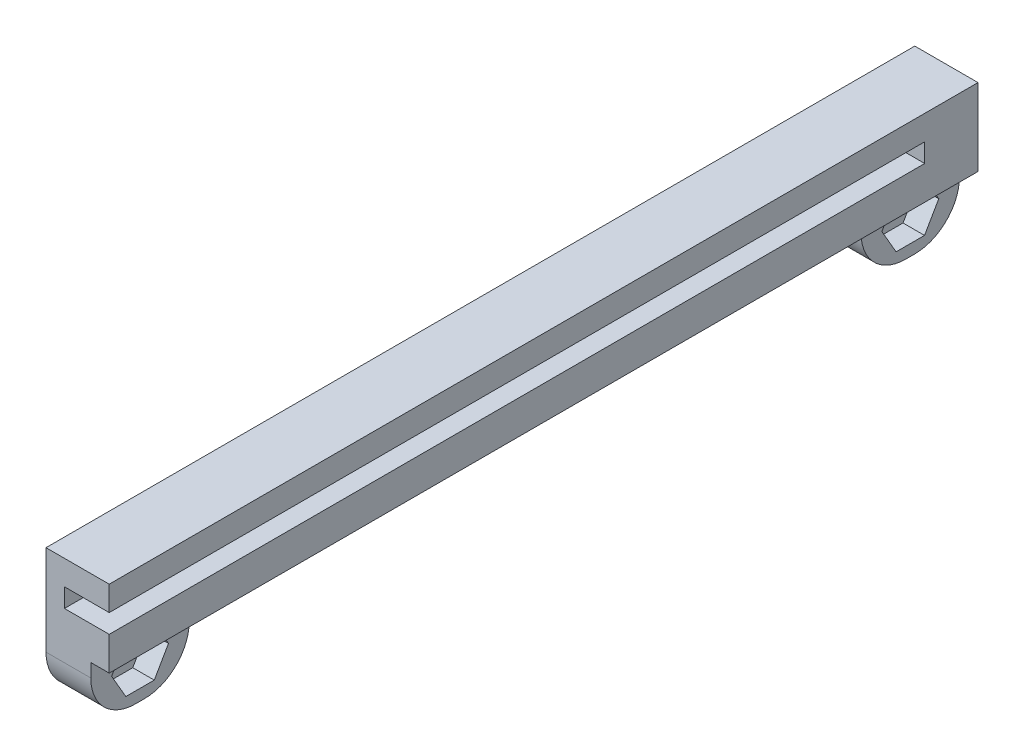
ISO-10303-21;
HEADER;
FILE_DESCRIPTION(('STEP AP214'),'2;1');
FILE_NAME('part.step','',(''),(''),'','','');
FILE_SCHEMA(('AUTOMOTIVE_DESIGN { 1 0 10303 214 1 1 1 1 }'));
ENDSEC;
DATA;
#1=APPLICATION_CONTEXT('core data for automotive mechanical design processes');
#2=APPLICATION_PROTOCOL_DEFINITION('international standard','automotive_design',2000,#1);
#3=PRODUCT_CONTEXT('',#1,'mechanical');
#4=PRODUCT('Part','Part','',(#3));
#5=PRODUCT_RELATED_PRODUCT_CATEGORY('part','',(#4));
#6=PRODUCT_DEFINITION_FORMATION('','',#4);
#7=PRODUCT_DEFINITION_CONTEXT('part definition',#1,'design');
#8=PRODUCT_DEFINITION('design','',#6,#7);
#9=PRODUCT_DEFINITION_SHAPE('','',#8);
#10=(LENGTH_UNIT() NAMED_UNIT(*) SI_UNIT(.MILLI.,.METRE.));
#11=(NAMED_UNIT(*) PLANE_ANGLE_UNIT() SI_UNIT($,.RADIAN.));
#12=(NAMED_UNIT(*) SI_UNIT($,.STERADIAN.) SOLID_ANGLE_UNIT());
#13=UNCERTAINTY_MEASURE_WITH_UNIT(LENGTH_MEASURE(1.E-05),#10,'distance_accuracy_value','');
#14=(GEOMETRIC_REPRESENTATION_CONTEXT(3) GLOBAL_UNCERTAINTY_ASSIGNED_CONTEXT((#13)) GLOBAL_UNIT_ASSIGNED_CONTEXT((#10,
#11,#12)) REPRESENTATION_CONTEXT('',''));
#15=CARTESIAN_POINT('',(0.,0.,0.));
#16=DIRECTION('',(0.,0.,1.));
#17=DIRECTION('',(1.,0.,0.));
#18=AXIS2_PLACEMENT_3D('',#15,#16,#17);
#19=CARTESIAN_POINT('',(3.52875,7.6,48.5));
#20=DIRECTION('',(-1.,0.,0.));
#21=DIRECTION('',(0.,0.,1.));
#22=AXIS2_PLACEMENT_3D('',#19,#20,#21);
#23=PLANE('',#22);
#24=DIRECTION('',(0.,0.,-1.));
#25=VECTOR('',#24,1.);
#26=CARTESIAN_POINT('',(3.52875,7.6,48.5));
#27=LINE('',#26,#25);
#28=CARTESIAN_POINT('',(3.52875000000002,7.6,48.5));
#29=VERTEX_POINT('',#28);
#30=CARTESIAN_POINT('',(3.52875,7.6,-48.5));
#31=VERTEX_POINT('',#30);
#32=EDGE_CURVE('E506',#29,#31,#27,.T.);
#33=ORIENTED_EDGE('',*,*,#32,.F.);
#34=DIRECTION('',(0.,1.,0.));
#35=VECTOR('',#34,1.);
#36=CARTESIAN_POINT('',(3.52875000000002,4.85,48.5));
#37=LINE('',#36,#35);
#38=CARTESIAN_POINT('',(3.52875000000002,4.85,48.5));
#39=VERTEX_POINT('',#38);
#40=EDGE_CURVE('E482',#39,#29,#37,.T.);
#41=ORIENTED_EDGE('',*,*,#40,.F.);
#42=DIRECTION('',(0.,0.,-1.));
#43=VECTOR('',#42,1.);
#44=CARTESIAN_POINT('',(3.52875,4.85,-42.55));
#45=LINE('',#44,#43);
#46=CARTESIAN_POINT('',(3.52875,4.85,-42.55));
#47=VERTEX_POINT('',#46);
#48=EDGE_CURVE('E468',#39,#47,#45,.T.);
#49=ORIENTED_EDGE('',*,*,#48,.T.);
#50=DIRECTION('',(0.,1.,0.));
#51=VECTOR('',#50,1.);
#52=CARTESIAN_POINT('',(3.52875,2.75,-42.55));
#53=LINE('',#52,#51);
#54=CARTESIAN_POINT('',(3.52875,2.75,-42.55));
#55=VERTEX_POINT('',#54);
#56=EDGE_CURVE('E501',#55,#47,#53,.T.);
#57=ORIENTED_EDGE('',*,*,#56,.F.);
#58=DIRECTION('',(0.,0.,-1.));
#59=VECTOR('',#58,1.);
#60=CARTESIAN_POINT('',(3.52875,2.75,-42.55));
#61=LINE('',#60,#59);
#62=CARTESIAN_POINT('',(3.52875000000002,2.75,48.5));
#63=VERTEX_POINT('',#62);
#64=EDGE_CURVE('E486',#63,#55,#61,.T.);
#65=ORIENTED_EDGE('',*,*,#64,.F.);
#66=DIRECTION('',(0.,-1.,0.));
#67=VECTOR('',#66,1.);
#68=CARTESIAN_POINT('',(3.52875,7.6,48.5));
#69=LINE('',#68,#67);
#70=CARTESIAN_POINT('',(3.52874999999999,-1.,48.5));
#71=VERTEX_POINT('',#70);
#72=EDGE_CURVE('E524',#63,#71,#69,.T.);
#73=ORIENTED_EDGE('',*,*,#72,.T.);
#74=DIRECTION('',(0.,0.,1.));
#75=VECTOR('',#74,1.);
#76=CARTESIAN_POINT('',(3.52874999999999,-1.,48.5));
#77=LINE('',#76,#75);
#78=CARTESIAN_POINT('',(3.52875,-1.,-48.5));
#79=VERTEX_POINT('',#78);
#80=EDGE_CURVE('E460',#79,#71,#77,.T.);
#81=ORIENTED_EDGE('',*,*,#80,.F.);
#82=DIRECTION('',(0.,-1.,0.));
#83=VECTOR('',#82,1.);
#84=CARTESIAN_POINT('',(3.52875,7.6,-48.5));
#85=LINE('',#84,#83);
#86=EDGE_CURVE('E535',#31,#79,#85,.T.);
#87=ORIENTED_EDGE('',*,*,#86,.F.);
#88=EDGE_LOOP('',(#33,#41,#49,#57,#65,#73,#81,#87));
#89=FACE_BOUND('',#88,.T.);
#90=ADVANCED_FACE('F39',(#89),#23,.F.);
#91=CARTESIAN_POINT('',(-3.52875000000001,7.6,-48.5));
#92=DIRECTION('',(0.,0.,1.));
#93=DIRECTION('',(1.,0.,0.));
#94=AXIS2_PLACEMENT_3D('',#91,#92,#93);
#95=PLANE('',#94);
#96=DIRECTION('',(0.,1.,0.));
#97=VECTOR('',#96,1.);
#98=CARTESIAN_POINT('',(1.47125,-7.5,-48.5));
#99=LINE('',#98,#97);
#100=CARTESIAN_POINT('',(1.47125,-2.5,-48.5));
#101=VERTEX_POINT('',#100);
#102=CARTESIAN_POINT('',(1.47125,-1.,-48.5));
#103=VERTEX_POINT('',#102);
#104=EDGE_CURVE('E405',#101,#103,#99,.T.);
#105=ORIENTED_EDGE('',*,*,#104,.F.);
#106=DIRECTION('',(1.,0.,0.));
#107=VECTOR('',#106,1.);
#108=CARTESIAN_POINT('',(-3.52875,-2.5,-48.5));
#109=LINE('',#108,#107);
#110=CARTESIAN_POINT('',(-3.52875000000001,-2.5,-48.5));
#111=VERTEX_POINT('',#110);
#112=EDGE_CURVE('E559',#101,#111,#109,.F.);
#113=ORIENTED_EDGE('',*,*,#112,.T.);
#114=DIRECTION('',(0.,-1.,0.));
#115=VECTOR('',#114,1.);
#116=CARTESIAN_POINT('',(-3.52875000000001,7.6,-48.5));
#117=LINE('',#116,#115);
#118=CARTESIAN_POINT('',(-3.52875000000001,7.6,-48.5));
#119=VERTEX_POINT('',#118);
#120=EDGE_CURVE('E531',#119,#111,#117,.T.);
#121=ORIENTED_EDGE('',*,*,#120,.F.);
#122=DIRECTION('',(-1.,0.,0.));
#123=VECTOR('',#122,1.);
#124=CARTESIAN_POINT('',(-3.52875000000001,7.6,-48.5));
#125=LINE('',#124,#123);
#126=EDGE_CURVE('E515',#31,#119,#125,.T.);
#127=ORIENTED_EDGE('',*,*,#126,.F.);
#128=ORIENTED_EDGE('',*,*,#86,.T.);
#129=DIRECTION('',(1.,0.,0.));
#130=VECTOR('',#129,1.);
#131=CARTESIAN_POINT('',(-3.52875,-1.,-48.5));
#132=LINE('',#131,#130);
#133=EDGE_CURVE('E457',#103,#79,#132,.T.);
#134=ORIENTED_EDGE('',*,*,#133,.F.);
#135=EDGE_LOOP('',(#105,#113,#121,#127,#128,#134));
#136=FACE_BOUND('',#135,.T.);
#137=ADVANCED_FACE('F628',(#136),#95,.F.);
#138=CARTESIAN_POINT('',(-3.52875000000001,7.6,48.5));
#139=DIRECTION('',(1.,0.,0.));
#140=DIRECTION('',(0.,0.,-1.));
#141=AXIS2_PLACEMENT_3D('',#138,#139,#140);
#142=PLANE('',#141);
#143=CARTESIAN_POINT('',(-3.52875000000003,-3.5,43.));
#144=DIRECTION('',(1.,0.,0.));
#145=DIRECTION('',(0.,0.,-1.));
#146=AXIS2_PLACEMENT_3D('',#143,#144,#145);
#147=CIRCLE('',#146,1.85);
#148=CARTESIAN_POINT('',(-3.52875000000003,-3.5,41.15));
#149=VERTEX_POINT('',#148);
#150=EDGE_CURVE('E362',#149,#149,#147,.T.);
#151=ORIENTED_EDGE('',*,*,#150,.T.);
#152=EDGE_LOOP('',(#151));
#153=FACE_BOUND('',#152,.T.);
#154=CARTESIAN_POINT('',(-3.52875000000001,-3.5,-43.));
#155=DIRECTION('',(1.,0.,0.));
#156=DIRECTION('',(0.,0.,-1.));
#157=AXIS2_PLACEMENT_3D('',#154,#155,#156);
#158=CIRCLE('',#157,1.85);
#159=CARTESIAN_POINT('',(-3.52875000000001,-3.5,-44.85));
#160=VERTEX_POINT('',#159);
#161=EDGE_CURVE('E285',#160,#160,#158,.T.);
#162=ORIENTED_EDGE('',*,*,#161,.T.);
#163=EDGE_LOOP('',(#162));
#164=FACE_BOUND('',#163,.T.);
#165=ORIENTED_EDGE('',*,*,#120,.T.);
#166=CARTESIAN_POINT('',(-3.52875000000001,-2.5,-43.5));
#167=DIRECTION('',(1.,0.,0.));
#168=DIRECTION('',(0.,0.,-1.));
#169=AXIS2_PLACEMENT_3D('',#166,#167,#168);
#170=CIRCLE('',#169,5.);
#171=CARTESIAN_POINT('',(-3.52875,-7.5,-43.5));
#172=VERTEX_POINT('',#171);
#173=EDGE_CURVE('E571',#111,#172,#170,.F.);
#174=ORIENTED_EDGE('',*,*,#173,.T.);
#175=DIRECTION('',(0.,0.,1.));
#176=VECTOR('',#175,1.);
#177=CARTESIAN_POINT('',(-3.52875,-7.5,-48.5));
#178=LINE('',#177,#176);
#179=CARTESIAN_POINT('',(-3.52875,-7.5,-42.5));
#180=VERTEX_POINT('',#179);
#181=EDGE_CURVE('E404',#172,#180,#178,.T.);
#182=ORIENTED_EDGE('',*,*,#181,.T.);
#183=CARTESIAN_POINT('',(-3.52875000000001,-2.5,-42.5));
#184=DIRECTION('',(1.,0.,0.));
#185=DIRECTION('',(0.,0.,-1.));
#186=AXIS2_PLACEMENT_3D('',#183,#184,#185);
#187=CIRCLE('',#186,5.);
#188=CARTESIAN_POINT('',(-3.52875,-2.5,-37.5));
#189=VERTEX_POINT('',#188);
#190=EDGE_CURVE('E568',#180,#189,#187,.F.);
#191=ORIENTED_EDGE('',*,*,#190,.T.);
#192=DIRECTION('',(0.,1.,0.));
#193=VECTOR('',#192,1.);
#194=CARTESIAN_POINT('',(-3.52875,-7.5,-37.5));
#195=LINE('',#194,#193);
#196=CARTESIAN_POINT('',(-3.52875,-1.,-37.5));
#197=VERTEX_POINT('',#196);
#198=EDGE_CURVE('E320',#189,#197,#195,.T.);
#199=ORIENTED_EDGE('',*,*,#198,.T.);
#200=DIRECTION('',(0.,0.,-1.));
#201=VECTOR('',#200,1.);
#202=CARTESIAN_POINT('',(-3.52875000000001,-1.,48.5));
#203=LINE('',#202,#201);
#204=CARTESIAN_POINT('',(-3.52875000000001,-1.,37.5));
#205=VERTEX_POINT('',#204);
#206=EDGE_CURVE('E453',#205,#197,#203,.T.);
#207=ORIENTED_EDGE('',*,*,#206,.F.);
#208=DIRECTION('',(0.,1.,0.));
#209=VECTOR('',#208,1.);
#210=CARTESIAN_POINT('',(-3.52875000000001,-7.5,37.5));
#211=LINE('',#210,#209);
#212=CARTESIAN_POINT('',(-3.52875000000001,-2.5,37.5));
#213=VERTEX_POINT('',#212);
#214=EDGE_CURVE('E436',#213,#205,#211,.T.);
#215=ORIENTED_EDGE('',*,*,#214,.F.);
#216=CARTESIAN_POINT('',(-3.52875000000001,-2.5,42.5));
#217=DIRECTION('',(1.,0.,0.));
#218=DIRECTION('',(0.,0.,-1.));
#219=AXIS2_PLACEMENT_3D('',#216,#217,#218);
#220=CIRCLE('',#219,5.);
#221=CARTESIAN_POINT('',(-3.52875000000001,-7.5,42.5));
#222=VERTEX_POINT('',#221);
#223=EDGE_CURVE('E565',#213,#222,#220,.F.);
#224=ORIENTED_EDGE('',*,*,#223,.T.);
#225=DIRECTION('',(0.,0.,-1.));
#226=VECTOR('',#225,1.);
#227=CARTESIAN_POINT('',(-3.52875000000001,-7.5,48.5));
#228=LINE('',#227,#226);
#229=CARTESIAN_POINT('',(-3.52875000000001,-7.5,43.5));
#230=VERTEX_POINT('',#229);
#231=EDGE_CURVE('E431',#230,#222,#228,.T.);
#232=ORIENTED_EDGE('',*,*,#231,.F.);
#233=CARTESIAN_POINT('',(-3.52875000000001,-2.5,43.5));
#234=DIRECTION('',(1.,0.,0.));
#235=DIRECTION('',(0.,0.,-1.));
#236=AXIS2_PLACEMENT_3D('',#233,#234,#235);
#237=CIRCLE('',#236,5.);
#238=CARTESIAN_POINT('',(-3.52875000000001,-2.5,48.5));
#239=VERTEX_POINT('',#238);
#240=EDGE_CURVE('E562',#230,#239,#237,.F.);
#241=ORIENTED_EDGE('',*,*,#240,.T.);
#242=DIRECTION('',(0.,-1.,0.));
#243=VECTOR('',#242,1.);
#244=CARTESIAN_POINT('',(-3.52875000000001,7.6,48.5));
#245=LINE('',#244,#243);
#246=CARTESIAN_POINT('',(-3.52875000000001,7.6,48.5));
#247=VERTEX_POINT('',#246);
#248=EDGE_CURVE('E527',#247,#239,#245,.T.);
#249=ORIENTED_EDGE('',*,*,#248,.F.);
#250=DIRECTION('',(0.,0.,1.));
#251=VECTOR('',#250,1.);
#252=CARTESIAN_POINT('',(-3.52875000000001,7.6,48.5));
#253=LINE('',#252,#251);
#254=EDGE_CURVE('E518',#119,#247,#253,.T.);
#255=ORIENTED_EDGE('',*,*,#254,.F.);
#256=EDGE_LOOP('',(#165,#174,#182,#191,#199,#207,#215,#224,#232,#241,#249,#255));
#257=FACE_BOUND('',#256,.T.);
#258=ADVANCED_FACE('F598',(#153,#164,#257),#142,.F.);
#259=CARTESIAN_POINT('',(-3.52875000000001,7.6,48.5));
#260=DIRECTION('',(0.,0.,-1.));
#261=DIRECTION('',(-1.,0.,0.));
#262=AXIS2_PLACEMENT_3D('',#259,#260,#261);
#263=PLANE('',#262);
#264=ORIENTED_EDGE('',*,*,#248,.T.);
#265=DIRECTION('',(1.,0.,0.));
#266=VECTOR('',#265,1.);
#267=CARTESIAN_POINT('',(-3.52875000000001,-2.5,48.5));
#268=LINE('',#267,#266);
#269=CARTESIAN_POINT('',(1.47124999999999,-2.5,48.5));
#270=VERTEX_POINT('',#269);
#271=EDGE_CURVE('E11',#239,#270,#268,.T.);
#272=ORIENTED_EDGE('',*,*,#271,.T.);
#273=DIRECTION('',(0.,1.,0.));
#274=VECTOR('',#273,1.);
#275=CARTESIAN_POINT('',(1.47124999999999,-7.5,48.5));
#276=LINE('',#275,#274);
#277=CARTESIAN_POINT('',(1.47124999999999,-1.,48.5));
#278=VERTEX_POINT('',#277);
#279=EDGE_CURVE('E447',#270,#278,#276,.T.);
#280=ORIENTED_EDGE('',*,*,#279,.T.);
#281=DIRECTION('',(-1.,0.,0.));
#282=VECTOR('',#281,1.);
#283=CARTESIAN_POINT('',(-3.52875000000001,-1.,48.5));
#284=LINE('',#283,#282);
#285=EDGE_CURVE('E464',#71,#278,#284,.T.);
#286=ORIENTED_EDGE('',*,*,#285,.F.);
#287=ORIENTED_EDGE('',*,*,#72,.F.);
#288=DIRECTION('',(1.,0.,0.));
#289=VECTOR('',#288,1.);
#290=CARTESIAN_POINT('',(3.52875000000002,2.75,48.5));
#291=LINE('',#290,#289);
#292=CARTESIAN_POINT('',(-1.47125000000001,2.75,48.5));
#293=VERTEX_POINT('',#292);
#294=EDGE_CURVE('E498',#293,#63,#291,.T.);
#295=ORIENTED_EDGE('',*,*,#294,.F.);
#296=DIRECTION('',(0.,1.,0.));
#297=VECTOR('',#296,1.);
#298=CARTESIAN_POINT('',(-1.47125000000001,2.75,48.5));
#299=LINE('',#298,#297);
#300=CARTESIAN_POINT('',(-1.47125000000001,4.85,48.5));
#301=VERTEX_POINT('',#300);
#302=EDGE_CURVE('E502',#293,#301,#299,.T.);
#303=ORIENTED_EDGE('',*,*,#302,.T.);
#304=DIRECTION('',(1.,0.,0.));
#305=VECTOR('',#304,1.);
#306=CARTESIAN_POINT('',(3.52875000000002,4.85,48.5));
#307=LINE('',#306,#305);
#308=EDGE_CURVE('E478',#301,#39,#307,.T.);
#309=ORIENTED_EDGE('',*,*,#308,.T.);
#310=ORIENTED_EDGE('',*,*,#40,.T.);
#311=DIRECTION('',(1.,0.,0.));
#312=VECTOR('',#311,1.);
#313=CARTESIAN_POINT('',(-3.52875000000001,7.6,48.5));
#314=LINE('',#313,#312);
#315=EDGE_CURVE('E521',#247,#29,#314,.T.);
#316=ORIENTED_EDGE('',*,*,#315,.F.);
#317=EDGE_LOOP('',(#264,#272,#280,#286,#287,#295,#303,#309,#310,#316));
#318=FACE_BOUND('',#317,.T.);
#319=ADVANCED_FACE('F611',(#318),#263,.F.);
#320=CARTESIAN_POINT('',(0.,7.6,0.));
#321=DIRECTION('',(0.,-1.,0.));
#322=DIRECTION('',(0.,0.,-1.));
#323=AXIS2_PLACEMENT_3D('',#320,#321,#322);
#324=PLANE('',#323);
#325=ORIENTED_EDGE('',*,*,#315,.T.);
#326=ORIENTED_EDGE('',*,*,#32,.T.);
#327=ORIENTED_EDGE('',*,*,#126,.T.);
#328=ORIENTED_EDGE('',*,*,#254,.T.);
#329=EDGE_LOOP('',(#325,#326,#327,#328));
#330=FACE_BOUND('',#329,.T.);
#331=ADVANCED_FACE('F619',(#330),#324,.F.);
#332=CARTESIAN_POINT('',(-1.47125000000001,2.75,-42.55));
#333=DIRECTION('',(-1.,0.,0.));
#334=DIRECTION('',(0.,0.,1.));
#335=AXIS2_PLACEMENT_3D('',#332,#333,#334);
#336=PLANE('',#335);
#337=DIRECTION('',(0.,1.,0.));
#338=VECTOR('',#337,1.);
#339=CARTESIAN_POINT('',(-1.47125000000001,2.75,-42.55));
#340=LINE('',#339,#338);
#341=CARTESIAN_POINT('',(-1.47125000000001,2.75,-42.55));
#342=VERTEX_POINT('',#341);
#343=CARTESIAN_POINT('',(-1.47125000000001,4.85,-42.55));
#344=VERTEX_POINT('',#343);
#345=EDGE_CURVE('E507',#342,#344,#340,.T.);
#346=ORIENTED_EDGE('',*,*,#345,.T.);
#347=DIRECTION('',(0.,0.,1.));
#348=VECTOR('',#347,1.);
#349=CARTESIAN_POINT('',(-1.47125000000002,4.85,-42.55));
#350=LINE('',#349,#348);
#351=EDGE_CURVE('E475',#344,#301,#350,.T.);
#352=ORIENTED_EDGE('',*,*,#351,.T.);
#353=ORIENTED_EDGE('',*,*,#302,.F.);
#354=DIRECTION('',(0.,0.,1.));
#355=VECTOR('',#354,1.);
#356=CARTESIAN_POINT('',(-1.47125000000001,2.75,-42.55));
#357=LINE('',#356,#355);
#358=EDGE_CURVE('E494',#342,#293,#357,.T.);
#359=ORIENTED_EDGE('',*,*,#358,.F.);
#360=EDGE_LOOP('',(#346,#352,#353,#359));
#361=FACE_BOUND('',#360,.T.);
#362=ADVANCED_FACE('F998',(#361),#336,.F.);
#363=CARTESIAN_POINT('',(3.52875,2.75,-42.55));
#364=DIRECTION('',(0.,0.,-1.));
#365=DIRECTION('',(-1.,0.,0.));
#366=AXIS2_PLACEMENT_3D('',#363,#364,#365);
#367=PLANE('',#366);
#368=ORIENTED_EDGE('',*,*,#56,.T.);
#369=DIRECTION('',(-1.,0.,0.));
#370=VECTOR('',#369,1.);
#371=CARTESIAN_POINT('',(3.52875,4.85,-42.55));
#372=LINE('',#371,#370);
#373=EDGE_CURVE('E472',#47,#344,#372,.T.);
#374=ORIENTED_EDGE('',*,*,#373,.T.);
#375=ORIENTED_EDGE('',*,*,#345,.F.);
#376=DIRECTION('',(-1.,0.,0.));
#377=VECTOR('',#376,1.);
#378=CARTESIAN_POINT('',(3.52875,2.75,-42.55));
#379=LINE('',#378,#377);
#380=EDGE_CURVE('E490',#55,#342,#379,.T.);
#381=ORIENTED_EDGE('',*,*,#380,.F.);
#382=EDGE_LOOP('',(#368,#374,#375,#381));
#383=FACE_BOUND('',#382,.T.);
#384=ADVANCED_FACE('F993',(#383),#367,.F.);
#385=CARTESIAN_POINT('',(0.,2.75,0.));
#386=DIRECTION('',(0.,-1.,0.));
#387=DIRECTION('',(0.,0.,-1.));
#388=AXIS2_PLACEMENT_3D('',#385,#386,#387);
#389=PLANE('',#388);
#390=ORIENTED_EDGE('',*,*,#64,.T.);
#391=ORIENTED_EDGE('',*,*,#380,.T.);
#392=ORIENTED_EDGE('',*,*,#358,.T.);
#393=ORIENTED_EDGE('',*,*,#294,.T.);
#394=EDGE_LOOP('',(#390,#391,#392,#393));
#395=FACE_BOUND('',#394,.T.);
#396=ADVANCED_FACE('F985',(#395),#389,.F.);
#397=CARTESIAN_POINT('',(0.,4.85,0.));
#398=DIRECTION('',(0.,-1.,0.));
#399=DIRECTION('',(0.,0.,-1.));
#400=AXIS2_PLACEMENT_3D('',#397,#398,#399);
#401=PLANE('',#400);
#402=ORIENTED_EDGE('',*,*,#48,.F.);
#403=ORIENTED_EDGE('',*,*,#308,.F.);
#404=ORIENTED_EDGE('',*,*,#351,.F.);
#405=ORIENTED_EDGE('',*,*,#373,.F.);
#406=EDGE_LOOP('',(#402,#403,#404,#405));
#407=FACE_BOUND('',#406,.T.);
#408=ADVANCED_FACE('F970',(#407),#401,.T.);
#409=CARTESIAN_POINT('',(0.,-1.,0.));
#410=DIRECTION('',(0.,-1.,0.));
#411=DIRECTION('',(0.,0.,-1.));
#412=AXIS2_PLACEMENT_3D('',#409,#410,#411);
#413=PLANE('',#412);
#414=DIRECTION('',(1.,0.,0.));
#415=VECTOR('',#414,1.);
#416=CARTESIAN_POINT('',(-3.52875,-1.,-37.5));
#417=LINE('',#416,#415);
#418=CARTESIAN_POINT('',(1.47125,-1.,-37.5));
#419=VERTEX_POINT('',#418);
#420=EDGE_CURVE('E414',#197,#419,#417,.T.);
#421=ORIENTED_EDGE('',*,*,#420,.T.);
#422=DIRECTION('',(0.,0.,1.));
#423=VECTOR('',#422,1.);
#424=CARTESIAN_POINT('',(1.47125,-1.,-48.5));
#425=LINE('',#424,#423);
#426=CARTESIAN_POINT('',(1.47125000000001,-1.,-41.2679491924311));
#427=VERTEX_POINT('',#426);
#428=EDGE_CURVE('E416',#427,#419,#425,.T.);
#429=ORIENTED_EDGE('',*,*,#428,.F.);
#430=CARTESIAN_POINT('',(1.47125000000001,-1.,-44.7320508075689));
#431=VERTEX_POINT('',#430);
#432=EDGE_CURVE('E415',#431,#427,#425,.T.);
#433=ORIENTED_EDGE('',*,*,#432,.F.);
#434=EDGE_CURVE('E410',#103,#431,#425,.T.);
#435=ORIENTED_EDGE('',*,*,#434,.F.);
#436=ORIENTED_EDGE('',*,*,#133,.T.);
#437=ORIENTED_EDGE('',*,*,#80,.T.);
#438=ORIENTED_EDGE('',*,*,#285,.T.);
#439=DIRECTION('',(0.,0.,-1.));
#440=VECTOR('',#439,1.);
#441=CARTESIAN_POINT('',(1.47124999999999,-1.,48.5));
#442=LINE('',#441,#440);
#443=CARTESIAN_POINT('',(1.47124999999999,-1.,44.7320508075689));
#444=VERTEX_POINT('',#443);
#445=EDGE_CURVE('E432',#278,#444,#442,.T.);
#446=ORIENTED_EDGE('',*,*,#445,.T.);
#447=CARTESIAN_POINT('',(1.47124999999999,-1.,41.2679491924311));
#448=VERTEX_POINT('',#447);
#449=EDGE_CURVE('E444',#444,#448,#442,.T.);
#450=ORIENTED_EDGE('',*,*,#449,.T.);
#451=CARTESIAN_POINT('',(1.47124999999999,-1.,37.5));
#452=VERTEX_POINT('',#451);
#453=EDGE_CURVE('E440',#448,#452,#442,.T.);
#454=ORIENTED_EDGE('',*,*,#453,.T.);
#455=DIRECTION('',(1.,0.,0.));
#456=VECTOR('',#455,1.);
#457=CARTESIAN_POINT('',(-3.52875000000001,-1.,37.5));
#458=LINE('',#457,#456);
#459=EDGE_CURVE('E420',#205,#452,#458,.T.);
#460=ORIENTED_EDGE('',*,*,#459,.F.);
#461=ORIENTED_EDGE('',*,*,#206,.T.);
#462=EDGE_LOOP('',(#421,#429,#433,#435,#436,#437,#438,#446,#450,#454,#460,#461));
#463=FACE_BOUND('',#462,.T.);
#464=ADVANCED_FACE('F654',(#463),#413,.T.);
#465=CARTESIAN_POINT('',(-3.52875000000001,-7.5,37.5));
#466=DIRECTION('',(0.,0.,1.));
#467=DIRECTION('',(1.,0.,0.));
#468=AXIS2_PLACEMENT_3D('',#465,#466,#467);
#469=PLANE('',#468);
#470=DIRECTION('',(0.,1.,0.));
#471=VECTOR('',#470,1.);
#472=CARTESIAN_POINT('',(1.47124999999999,-7.5,37.5));
#473=LINE('',#472,#471);
#474=CARTESIAN_POINT('',(1.47124999999999,-2.5,37.5));
#475=VERTEX_POINT('',#474);
#476=EDGE_CURVE('E450',#475,#452,#473,.T.);
#477=ORIENTED_EDGE('',*,*,#476,.F.);
#478=DIRECTION('',(1.,0.,0.));
#479=VECTOR('',#478,1.);
#480=CARTESIAN_POINT('',(-3.52875000000001,-2.5,37.5));
#481=LINE('',#480,#479);
#482=EDGE_CURVE('E48',#475,#213,#481,.F.);
#483=ORIENTED_EDGE('',*,*,#482,.T.);
#484=ORIENTED_EDGE('',*,*,#214,.T.);
#485=ORIENTED_EDGE('',*,*,#459,.T.);
#486=EDGE_LOOP('',(#477,#483,#484,#485));
#487=FACE_BOUND('',#486,.T.);
#488=ADVANCED_FACE('F592',(#487),#469,.F.);
#489=CARTESIAN_POINT('',(1.47124999999999,-7.5,48.5));
#490=DIRECTION('',(1.,0.,0.));
#491=DIRECTION('',(0.,0.,-1.));
#492=AXIS2_PLACEMENT_3D('',#489,#490,#491);
#493=PLANE('',#492);
#494=DIRECTION('',(0.,0.,-1.));
#495=VECTOR('',#494,1.);
#496=CARTESIAN_POINT('',(1.47124999999999,-7.5,48.5));
#497=LINE('',#496,#495);
#498=CARTESIAN_POINT('',(1.47124999999999,-7.5,43.5));
#499=VERTEX_POINT('',#498);
#500=CARTESIAN_POINT('',(1.47124999999999,-7.5,42.5));
#501=VERTEX_POINT('',#500);
#502=EDGE_CURVE('E428',#499,#501,#497,.T.);
#503=ORIENTED_EDGE('',*,*,#502,.T.);
#504=CARTESIAN_POINT('',(1.47124999999999,-2.5,42.5));
#505=DIRECTION('',(1.,0.,0.));
#506=DIRECTION('',(0.,0.,-1.));
#507=AXIS2_PLACEMENT_3D('',#504,#505,#506);
#508=CIRCLE('',#507,5.);
#509=EDGE_CURVE('E55',#501,#475,#508,.T.);
#510=ORIENTED_EDGE('',*,*,#509,.T.);
#511=ORIENTED_EDGE('',*,*,#476,.T.);
#512=ORIENTED_EDGE('',*,*,#453,.F.);
#513=DIRECTION('',(0.,0.866025403784438,0.5));
#514=VECTOR('',#513,1.);
#515=CARTESIAN_POINT('',(1.47124999999999,-3.49999999999999,39.8245735194571));
#516=LINE('',#515,#514);
#517=CARTESIAN_POINT('',(1.47124999999999,-3.49999999999999,39.8245735194571));
#518=VERTEX_POINT('',#517);
#519=EDGE_CURVE('E278',#518,#448,#516,.T.);
#520=ORIENTED_EDGE('',*,*,#519,.F.);
#521=DIRECTION('',(0.,0.866025403784439,-0.5));
#522=VECTOR('',#521,1.);
#523=CARTESIAN_POINT('',(1.47124999999999,-6.25,41.4122867597286));
#524=LINE('',#523,#522);
#525=CARTESIAN_POINT('',(1.47124999999999,-6.25,41.4122867597286));
#526=VERTEX_POINT('',#525);
#527=EDGE_CURVE('E313',#526,#518,#524,.T.);
#528=ORIENTED_EDGE('',*,*,#527,.F.);
#529=DIRECTION('',(0.,0.,-1.));
#530=VECTOR('',#529,1.);
#531=CARTESIAN_POINT('',(1.47124999999999,-6.25,44.5877132402715));
#532=LINE('',#531,#530);
#533=CARTESIAN_POINT('',(1.47124999999999,-6.25,44.5877132402715));
#534=VERTEX_POINT('',#533);
#535=EDGE_CURVE('E309',#534,#526,#532,.T.);
#536=ORIENTED_EDGE('',*,*,#535,.F.);
#537=DIRECTION('',(0.,-0.866025403784439,-0.5));
#538=VECTOR('',#537,1.);
#539=CARTESIAN_POINT('',(1.47124999999999,-3.49999999999999,46.175426480543));
#540=LINE('',#539,#538);
#541=CARTESIAN_POINT('',(1.47124999999999,-3.49999999999999,46.175426480543));
#542=VERTEX_POINT('',#541);
#543=EDGE_CURVE('E305',#542,#534,#540,.T.);
#544=ORIENTED_EDGE('',*,*,#543,.F.);
#545=DIRECTION('',(0.,-0.866025403784439,0.5));
#546=VECTOR('',#545,1.);
#547=CARTESIAN_POINT('',(1.47124999999999,-7.5065698604072,48.4886206679761));
#548=LINE('',#547,#546);
#549=EDGE_CURVE('E543',#444,#542,#548,.T.);
#550=ORIENTED_EDGE('',*,*,#549,.F.);
#551=ORIENTED_EDGE('',*,*,#445,.F.);
#552=ORIENTED_EDGE('',*,*,#279,.F.);
#553=CARTESIAN_POINT('',(1.47124999999999,-2.5,43.5));
#554=DIRECTION('',(1.,0.,0.));
#555=DIRECTION('',(0.,0.,-1.));
#556=AXIS2_PLACEMENT_3D('',#553,#554,#555);
#557=CIRCLE('',#556,5.);
#558=EDGE_CURVE('E63',#270,#499,#557,.T.);
#559=ORIENTED_EDGE('',*,*,#558,.T.);
#560=EDGE_LOOP('',(#503,#510,#511,#512,#520,#528,#536,#544,#550,#551,#552,#559));
#561=FACE_BOUND('',#560,.T.);
#562=ADVANCED_FACE('F605',(#561),#493,.T.);
#563=CARTESIAN_POINT('',(0.,-7.5,0.));
#564=DIRECTION('',(0.,1.,0.));
#565=DIRECTION('',(0.,0.,1.));
#566=AXIS2_PLACEMENT_3D('',#563,#564,#565);
#567=PLANE('',#566);
#568=ORIENTED_EDGE('',*,*,#231,.T.);
#569=DIRECTION('',(1.,0.,0.));
#570=VECTOR('',#569,1.);
#571=CARTESIAN_POINT('',(0.,-7.5,42.5));
#572=LINE('',#571,#570);
#573=EDGE_CURVE('E581',#222,#501,#572,.T.);
#574=ORIENTED_EDGE('',*,*,#573,.T.);
#575=ORIENTED_EDGE('',*,*,#502,.F.);
#576=DIRECTION('',(1.,0.,0.));
#577=VECTOR('',#576,1.);
#578=CARTESIAN_POINT('',(0.,-7.5,43.5));
#579=LINE('',#578,#577);
#580=EDGE_CURVE('E578',#499,#230,#579,.F.);
#581=ORIENTED_EDGE('',*,*,#580,.T.);
#582=EDGE_LOOP('',(#568,#574,#575,#581));
#583=FACE_BOUND('',#582,.T.);
#584=ADVANCED_FACE('F604',(#583),#567,.F.);
#585=CARTESIAN_POINT('',(-3.52875,-7.5,-37.5));
#586=DIRECTION('',(0.,0.,1.));
#587=DIRECTION('',(1.,0.,0.));
#588=AXIS2_PLACEMENT_3D('',#585,#586,#587);
#589=PLANE('',#588);
#590=ORIENTED_EDGE('',*,*,#198,.F.);
#591=DIRECTION('',(1.,0.,0.));
#592=VECTOR('',#591,1.);
#593=CARTESIAN_POINT('',(-3.52875,-2.5,-37.5));
#594=LINE('',#593,#592);
#595=CARTESIAN_POINT('',(1.47125,-2.5,-37.5));
#596=VERTEX_POINT('',#595);
#597=EDGE_CURVE('E574',#189,#596,#594,.T.);
#598=ORIENTED_EDGE('',*,*,#597,.T.);
#599=DIRECTION('',(0.,1.,0.));
#600=VECTOR('',#599,1.);
#601=CARTESIAN_POINT('',(1.47125,-7.5,-37.5));
#602=LINE('',#601,#600);
#603=EDGE_CURVE('E401',#596,#419,#602,.T.);
#604=ORIENTED_EDGE('',*,*,#603,.T.);
#605=ORIENTED_EDGE('',*,*,#420,.F.);
#606=EDGE_LOOP('',(#590,#598,#604,#605));
#607=FACE_BOUND('',#606,.T.);
#608=ADVANCED_FACE('F650',(#607),#589,.T.);
#609=CARTESIAN_POINT('',(1.47125,-7.5,-48.5));
#610=DIRECTION('',(-1.,0.,0.));
#611=DIRECTION('',(0.,0.,1.));
#612=AXIS2_PLACEMENT_3D('',#609,#610,#611);
#613=PLANE('',#612);
#614=DIRECTION('',(0.,0.,1.));
#615=VECTOR('',#614,1.);
#616=CARTESIAN_POINT('',(1.47125,-7.5,-48.5));
#617=LINE('',#616,#615);
#618=CARTESIAN_POINT('',(1.47125,-7.5,-43.5));
#619=VERTEX_POINT('',#618);
#620=CARTESIAN_POINT('',(1.47125,-7.5,-42.5));
#621=VERTEX_POINT('',#620);
#622=EDGE_CURVE('E424',#619,#621,#617,.T.);
#623=ORIENTED_EDGE('',*,*,#622,.F.);
#624=CARTESIAN_POINT('',(1.47125,-2.5,-43.5));
#625=DIRECTION('',(-1.,0.,0.));
#626=DIRECTION('',(0.,0.,1.));
#627=AXIS2_PLACEMENT_3D('',#624,#625,#626);
#628=CIRCLE('',#627,5.);
#629=EDGE_CURVE('E556',#619,#101,#628,.F.);
#630=ORIENTED_EDGE('',*,*,#629,.T.);
#631=ORIENTED_EDGE('',*,*,#104,.T.);
#632=ORIENTED_EDGE('',*,*,#434,.T.);
#633=DIRECTION('',(0.,0.866025403784439,0.5));
#634=VECTOR('',#633,1.);
#635=CARTESIAN_POINT('',(1.47125000000001,-3.5,-46.1754264805429));
#636=LINE('',#635,#634);
#637=CARTESIAN_POINT('',(1.47125,-3.5,-46.1754264805429));
#638=VERTEX_POINT('',#637);
#639=EDGE_CURVE('E363',#638,#431,#636,.T.);
#640=ORIENTED_EDGE('',*,*,#639,.F.);
#641=DIRECTION('',(0.,0.866025403784439,-0.5));
#642=VECTOR('',#641,1.);
#643=CARTESIAN_POINT('',(1.47125000000001,-6.25,-44.5877132402715));
#644=LINE('',#643,#642);
#645=CARTESIAN_POINT('',(1.47125000000001,-6.25,-44.5877132402715));
#646=VERTEX_POINT('',#645);
#647=EDGE_CURVE('E358',#646,#638,#644,.T.);
#648=ORIENTED_EDGE('',*,*,#647,.F.);
#649=DIRECTION('',(0.,0.,-1.));
#650=VECTOR('',#649,1.);
#651=CARTESIAN_POINT('',(1.47125000000001,-6.25,-41.4122867597285));
#652=LINE('',#651,#650);
#653=CARTESIAN_POINT('',(1.47125000000001,-6.25,-41.4122867597285));
#654=VERTEX_POINT('',#653);
#655=EDGE_CURVE('E337',#654,#646,#652,.T.);
#656=ORIENTED_EDGE('',*,*,#655,.F.);
#657=DIRECTION('',(0.,-0.866025403784438,-0.5));
#658=VECTOR('',#657,1.);
#659=CARTESIAN_POINT('',(1.47125000000001,-3.5,-39.824573519457));
#660=LINE('',#659,#658);
#661=CARTESIAN_POINT('',(1.47125000000001,-3.5,-39.824573519457));
#662=VERTEX_POINT('',#661);
#663=EDGE_CURVE('E375',#662,#654,#660,.T.);
#664=ORIENTED_EDGE('',*,*,#663,.F.);
#665=DIRECTION('',(0.,0.866025403784438,-0.500000000000001));
#666=VECTOR('',#665,1.);
#667=CARTESIAN_POINT('',(1.47125,-2.74343013959279,-40.2613793320239));
#668=LINE('',#667,#666);
#669=EDGE_CURVE('E539',#662,#427,#668,.T.);
#670=ORIENTED_EDGE('',*,*,#669,.T.);
#671=ORIENTED_EDGE('',*,*,#428,.T.);
#672=ORIENTED_EDGE('',*,*,#603,.F.);
#673=CARTESIAN_POINT('',(1.47125,-2.5,-42.5));
#674=DIRECTION('',(-1.,0.,0.));
#675=DIRECTION('',(0.,0.,1.));
#676=AXIS2_PLACEMENT_3D('',#673,#674,#675);
#677=CIRCLE('',#676,5.);
#678=EDGE_CURVE('E553',#596,#621,#677,.F.);
#679=ORIENTED_EDGE('',*,*,#678,.T.);
#680=EDGE_LOOP('',(#623,#630,#631,#632,#640,#648,#656,#664,#670,#671,#672,#679));
#681=FACE_BOUND('',#680,.T.);
#682=ADVANCED_FACE('F641',(#681),#613,.F.);
#683=CARTESIAN_POINT('',(0.,-7.5,0.));
#684=DIRECTION('',(0.,-1.,0.));
#685=DIRECTION('',(0.,0.,-1.));
#686=AXIS2_PLACEMENT_3D('',#683,#684,#685);
#687=PLANE('',#686);
#688=ORIENTED_EDGE('',*,*,#181,.F.);
#689=DIRECTION('',(1.,0.,0.));
#690=VECTOR('',#689,1.);
#691=CARTESIAN_POINT('',(1.47125,-7.5,-43.5));
#692=LINE('',#691,#690);
#693=EDGE_CURVE('E549',#172,#619,#692,.T.);
#694=ORIENTED_EDGE('',*,*,#693,.T.);
#695=ORIENTED_EDGE('',*,*,#622,.T.);
#696=DIRECTION('',(1.,0.,0.));
#697=VECTOR('',#696,1.);
#698=CARTESIAN_POINT('',(0.,-7.5,-42.5));
#699=LINE('',#698,#697);
#700=EDGE_CURVE('E546',#621,#180,#699,.F.);
#701=ORIENTED_EDGE('',*,*,#700,.T.);
#702=EDGE_LOOP('',(#688,#694,#695,#701));
#703=FACE_BOUND('',#702,.T.);
#704=ADVANCED_FACE('F638',(#703),#687,.T.);
#705=CARTESIAN_POINT('',(-0.928749999999989,-6.25,-44.5877132402715));
#706=DIRECTION('',(0.,-0.5,-0.866025403784439));
#707=DIRECTION('',(0.,0.866025403784439,-0.5));
#708=AXIS2_PLACEMENT_3D('',#705,#706,#707);
#709=PLANE('',#708);
#710=ORIENTED_EDGE('',*,*,#647,.T.);
#711=DIRECTION('',(1.,0.,0.));
#712=VECTOR('',#711,1.);
#713=CARTESIAN_POINT('',(-0.928749999999989,-3.5,-46.1754264805429));
#714=LINE('',#713,#712);
#715=CARTESIAN_POINT('',(-0.928749999999989,-3.5,-46.1754264805429));
#716=VERTEX_POINT('',#715);
#717=EDGE_CURVE('E357',#716,#638,#714,.T.);
#718=ORIENTED_EDGE('',*,*,#717,.F.);
#719=DIRECTION('',(0.,0.866025403784439,-0.5));
#720=VECTOR('',#719,1.);
#721=CARTESIAN_POINT('',(-0.928749999999989,-6.25,-44.5877132402715));
#722=LINE('',#721,#720);
#723=CARTESIAN_POINT('',(-0.928749999999989,-6.25,-44.5877132402715));
#724=VERTEX_POINT('',#723);
#725=EDGE_CURVE('E332',#724,#716,#722,.T.);
#726=ORIENTED_EDGE('',*,*,#725,.F.);
#727=DIRECTION('',(1.,0.,0.));
#728=VECTOR('',#727,1.);
#729=CARTESIAN_POINT('',(-0.928749999999989,-6.25,-44.5877132402715));
#730=LINE('',#729,#728);
#731=EDGE_CURVE('E302',#724,#646,#730,.T.);
#732=ORIENTED_EDGE('',*,*,#731,.T.);
#733=EDGE_LOOP('',(#710,#718,#726,#732));
#734=FACE_BOUND('',#733,.T.);
#735=ADVANCED_FACE('F677',(#734),#709,.F.);
#736=CARTESIAN_POINT('',(-0.92874999999999,-6.25,-41.4122867597285));
#737=DIRECTION('',(0.,-1.,0.));
#738=DIRECTION('',(0.,0.,-1.));
#739=AXIS2_PLACEMENT_3D('',#736,#737,#738);
#740=PLANE('',#739);
#741=ORIENTED_EDGE('',*,*,#655,.T.);
#742=ORIENTED_EDGE('',*,*,#731,.F.);
#743=DIRECTION('',(0.,0.,-1.));
#744=VECTOR('',#743,1.);
#745=CARTESIAN_POINT('',(-0.92874999999999,-6.25,-41.4122867597285));
#746=LINE('',#745,#744);
#747=CARTESIAN_POINT('',(-0.92874999999999,-6.25,-41.4122867597285));
#748=VERTEX_POINT('',#747);
#749=EDGE_CURVE('E353',#748,#724,#746,.T.);
#750=ORIENTED_EDGE('',*,*,#749,.F.);
#751=DIRECTION('',(1.,0.,0.));
#752=VECTOR('',#751,1.);
#753=CARTESIAN_POINT('',(-0.92874999999999,-6.25,-41.4122867597285));
#754=LINE('',#753,#752);
#755=EDGE_CURVE('E384',#748,#654,#754,.T.);
#756=ORIENTED_EDGE('',*,*,#755,.T.);
#757=EDGE_LOOP('',(#741,#742,#750,#756));
#758=FACE_BOUND('',#757,.T.);
#759=ADVANCED_FACE('F680',(#758),#740,.F.);
#760=CARTESIAN_POINT('',(-0.92874999999999,-3.5,-39.824573519457));
#761=DIRECTION('',(0.,-0.5,0.866025403784438));
#762=DIRECTION('',(0.,-0.866025403784439,-0.5));
#763=AXIS2_PLACEMENT_3D('',#760,#761,#762);
#764=PLANE('',#763);
#765=ORIENTED_EDGE('',*,*,#663,.T.);
#766=ORIENTED_EDGE('',*,*,#755,.F.);
#767=DIRECTION('',(0.,-0.866025403784438,-0.5));
#768=VECTOR('',#767,1.);
#769=CARTESIAN_POINT('',(-0.92874999999999,-3.5,-39.824573519457));
#770=LINE('',#769,#768);
#771=CARTESIAN_POINT('',(-0.92874999999999,-3.5,-39.824573519457));
#772=VERTEX_POINT('',#771);
#773=EDGE_CURVE('E349',#772,#748,#770,.T.);
#774=ORIENTED_EDGE('',*,*,#773,.F.);
#775=DIRECTION('',(1.,0.,0.));
#776=VECTOR('',#775,1.);
#777=CARTESIAN_POINT('',(-0.92874999999999,-3.5,-39.824573519457));
#778=LINE('',#777,#776);
#779=EDGE_CURVE('E387',#772,#662,#778,.T.);
#780=ORIENTED_EDGE('',*,*,#779,.T.);
#781=EDGE_LOOP('',(#765,#766,#774,#780));
#782=FACE_BOUND('',#781,.T.);
#783=ADVANCED_FACE('F682',(#782),#764,.F.);
#784=CARTESIAN_POINT('',(-0.92874999999999,-0.749999999999994,-41.4122867597285));
#785=DIRECTION('',(0.,0.5,0.866025403784438));
#786=DIRECTION('',(0.,-0.866025403784438,0.500000000000001));
#787=AXIS2_PLACEMENT_3D('',#784,#785,#786);
#788=PLANE('',#787);
#789=DIRECTION('',(0.,-0.866025403784438,0.500000000000001));
#790=VECTOR('',#789,1.);
#791=CARTESIAN_POINT('',(1.47125000000001,-0.749999999999994,-41.4122867597285));
#792=LINE('',#791,#790);
#793=CARTESIAN_POINT('',(1.47125000000001,-0.749999999999994,-41.4122867597285));
#794=VERTEX_POINT('',#793);
#795=EDGE_CURVE('E371',#794,#427,#792,.T.);
#796=ORIENTED_EDGE('',*,*,#795,.T.);
#797=ORIENTED_EDGE('',*,*,#669,.F.);
#798=ORIENTED_EDGE('',*,*,#779,.F.);
#799=DIRECTION('',(0.,-0.866025403784438,0.500000000000001));
#800=VECTOR('',#799,1.);
#801=CARTESIAN_POINT('',(-0.92874999999999,-0.749999999999994,-41.4122867597285));
#802=LINE('',#801,#800);
#803=CARTESIAN_POINT('',(-0.92874999999999,-0.749999999999994,-41.4122867597285));
#804=VERTEX_POINT('',#803);
#805=EDGE_CURVE('E345',#804,#772,#802,.T.);
#806=ORIENTED_EDGE('',*,*,#805,.F.);
#807=DIRECTION('',(1.,0.,0.));
#808=VECTOR('',#807,1.);
#809=CARTESIAN_POINT('',(-0.92874999999999,-0.749999999999994,-41.4122867597285));
#810=LINE('',#809,#808);
#811=EDGE_CURVE('E391',#804,#794,#810,.T.);
#812=ORIENTED_EDGE('',*,*,#811,.T.);
#813=EDGE_LOOP('',(#796,#797,#798,#806,#812));
#814=FACE_BOUND('',#813,.T.);
#815=ADVANCED_FACE('F686',(#814),#788,.F.);
#816=CARTESIAN_POINT('',(-0.928749999999989,-0.749999999999994,-44.5877132402715));
#817=DIRECTION('',(0.,1.,0.));
#818=DIRECTION('',(0.,0.,1.));
#819=AXIS2_PLACEMENT_3D('',#816,#817,#818);
#820=PLANE('',#819);
#821=DIRECTION('',(0.,0.,1.));
#822=VECTOR('',#821,1.);
#823=CARTESIAN_POINT('',(1.47125000000001,-0.749999999999994,-44.5877132402715));
#824=LINE('',#823,#822);
#825=CARTESIAN_POINT('',(1.47125000000001,-0.749999999999994,-44.5877132402715));
#826=VERTEX_POINT('',#825);
#827=EDGE_CURVE('E367',#826,#794,#824,.T.);
#828=ORIENTED_EDGE('',*,*,#827,.T.);
#829=ORIENTED_EDGE('',*,*,#811,.F.);
#830=DIRECTION('',(0.,0.,1.));
#831=VECTOR('',#830,1.);
#832=CARTESIAN_POINT('',(-0.928749999999989,-0.749999999999994,-44.5877132402715));
#833=LINE('',#832,#831);
#834=CARTESIAN_POINT('',(-0.928749999999989,-0.749999999999994,-44.5877132402715));
#835=VERTEX_POINT('',#834);
#836=EDGE_CURVE('E341',#835,#804,#833,.T.);
#837=ORIENTED_EDGE('',*,*,#836,.F.);
#838=DIRECTION('',(1.,0.,0.));
#839=VECTOR('',#838,1.);
#840=CARTESIAN_POINT('',(-0.928749999999989,-0.749999999999994,-44.5877132402715));
#841=LINE('',#840,#839);
#842=EDGE_CURVE('E394',#835,#826,#841,.T.);
#843=ORIENTED_EDGE('',*,*,#842,.T.);
#844=EDGE_LOOP('',(#828,#829,#837,#843));
#845=FACE_BOUND('',#844,.T.);
#846=ADVANCED_FACE('F690',(#845),#820,.F.);
#847=CARTESIAN_POINT('',(-0.928749999999989,-3.5,-46.1754264805429));
#848=DIRECTION('',(0.,0.5,-0.866025403784439));
#849=DIRECTION('',(0.,0.866025403784439,0.5));
#850=AXIS2_PLACEMENT_3D('',#847,#848,#849);
#851=PLANE('',#850);
#852=ORIENTED_EDGE('',*,*,#639,.T.);
#853=EDGE_CURVE('E361',#431,#826,#636,.T.);
#854=ORIENTED_EDGE('',*,*,#853,.T.);
#855=ORIENTED_EDGE('',*,*,#842,.F.);
#856=DIRECTION('',(0.,0.866025403784439,0.5));
#857=VECTOR('',#856,1.);
#858=CARTESIAN_POINT('',(-0.928749999999989,-3.5,-46.1754264805429));
#859=LINE('',#858,#857);
#860=EDGE_CURVE('E336',#716,#835,#859,.T.);
#861=ORIENTED_EDGE('',*,*,#860,.F.);
#862=ORIENTED_EDGE('',*,*,#717,.T.);
#863=EDGE_LOOP('',(#852,#854,#855,#861,#862));
#864=FACE_BOUND('',#863,.T.);
#865=ADVANCED_FACE('F673',(#864),#851,.F.);
#866=CARTESIAN_POINT('',(-0.928749999999995,0.,0.));
#867=DIRECTION('',(1.,0.,0.));
#868=DIRECTION('',(0.,0.,-1.));
#869=AXIS2_PLACEMENT_3D('',#866,#867,#868);
#870=PLANE('',#869);
#871=CARTESIAN_POINT('',(-0.928749999999989,-3.5,-43.));
#872=DIRECTION('',(1.,0.,0.));
#873=DIRECTION('',(0.,0.,-1.));
#874=AXIS2_PLACEMENT_3D('',#871,#872,#873);
#875=CIRCLE('',#874,1.85);
#876=CARTESIAN_POINT('',(-0.928749999999989,-3.5,-44.85));
#877=VERTEX_POINT('',#876);
#878=EDGE_CURVE('E1076',#877,#877,#875,.T.);
#879=ORIENTED_EDGE('',*,*,#878,.F.);
#880=EDGE_LOOP('',(#879));
#881=FACE_BOUND('',#880,.T.);
#882=ORIENTED_EDGE('',*,*,#725,.T.);
#883=ORIENTED_EDGE('',*,*,#860,.T.);
#884=ORIENTED_EDGE('',*,*,#836,.T.);
#885=ORIENTED_EDGE('',*,*,#805,.T.);
#886=ORIENTED_EDGE('',*,*,#773,.T.);
#887=ORIENTED_EDGE('',*,*,#749,.T.);
#888=EDGE_LOOP('',(#882,#883,#884,#885,#886,#887));
#889=FACE_BOUND('',#888,.T.);
#890=ADVANCED_FACE('F693',(#881,#889),#870,.T.);
#891=CARTESIAN_POINT('',(1.47125,0.,0.));
#892=DIRECTION('',(1.,0.,0.));
#893=DIRECTION('',(0.,0.,-1.));
#894=AXIS2_PLACEMENT_3D('',#891,#892,#893);
#895=PLANE('',#894);
#896=ORIENTED_EDGE('',*,*,#432,.T.);
#897=ORIENTED_EDGE('',*,*,#795,.F.);
#898=ORIENTED_EDGE('',*,*,#827,.F.);
#899=ORIENTED_EDGE('',*,*,#853,.F.);
#900=EDGE_LOOP('',(#896,#897,#898,#899));
#901=FACE_BOUND('',#900,.T.);
#902=ADVANCED_FACE('F688',(#901),#895,.F.);
#903=CARTESIAN_POINT('',(-0.928750000000006,-0.750000000000002,41.4122867597285));
#904=DIRECTION('',(0.,1.,0.));
#905=DIRECTION('',(0.,0.,1.));
#906=AXIS2_PLACEMENT_3D('',#903,#904,#905);
#907=PLANE('',#906);
#908=DIRECTION('',(0.,0.,1.));
#909=VECTOR('',#908,1.);
#910=CARTESIAN_POINT('',(1.47124999999999,-0.750000000000002,41.4122867597285));
#911=LINE('',#910,#909);
#912=CARTESIAN_POINT('',(1.47124999999999,-0.750000000000002,41.4122867597285));
#913=VERTEX_POINT('',#912);
#914=CARTESIAN_POINT('',(1.47124999999999,-0.750000000000001,44.5877132402715));
#915=VERTEX_POINT('',#914);
#916=EDGE_CURVE('E257',#913,#915,#911,.T.);
#917=ORIENTED_EDGE('',*,*,#916,.T.);
#918=DIRECTION('',(1.,0.,0.));
#919=VECTOR('',#918,1.);
#920=CARTESIAN_POINT('',(-0.928750000000007,-0.750000000000001,44.5877132402715));
#921=LINE('',#920,#919);
#922=CARTESIAN_POINT('',(-0.928750000000007,-0.750000000000001,44.5877132402715));
#923=VERTEX_POINT('',#922);
#924=EDGE_CURVE('E249',#923,#915,#921,.T.);
#925=ORIENTED_EDGE('',*,*,#924,.F.);
#926=DIRECTION('',(0.,0.,1.));
#927=VECTOR('',#926,1.);
#928=CARTESIAN_POINT('',(-0.928750000000006,-0.750000000000002,41.4122867597285));
#929=LINE('',#928,#927);
#930=CARTESIAN_POINT('',(-0.928750000000006,-0.750000000000002,41.4122867597285));
#931=VERTEX_POINT('',#930);
#932=EDGE_CURVE('E254',#931,#923,#929,.T.);
#933=ORIENTED_EDGE('',*,*,#932,.F.);
#934=DIRECTION('',(1.,0.,0.));
#935=VECTOR('',#934,1.);
#936=CARTESIAN_POINT('',(-0.928750000000006,-0.750000000000002,41.4122867597285));
#937=LINE('',#936,#935);
#938=EDGE_CURVE('E317',#931,#913,#937,.T.);
#939=ORIENTED_EDGE('',*,*,#938,.T.);
#940=EDGE_LOOP('',(#917,#925,#933,#939));
#941=FACE_BOUND('',#940,.T.);
#942=ADVANCED_FACE('F251',(#941),#907,.F.);
#943=CARTESIAN_POINT('',(-0.928750000000006,-3.49999999999999,39.8245735194571));
#944=DIRECTION('',(0.,0.5,-0.866025403784438));
#945=DIRECTION('',(0.,0.866025403784439,0.5));
#946=AXIS2_PLACEMENT_3D('',#943,#944,#945);
#947=PLANE('',#946);
#948=ORIENTED_EDGE('',*,*,#519,.T.);
#949=EDGE_CURVE('E282',#448,#913,#516,.T.);
#950=ORIENTED_EDGE('',*,*,#949,.T.);
#951=ORIENTED_EDGE('',*,*,#938,.F.);
#952=DIRECTION('',(0.,0.866025403784438,0.5));
#953=VECTOR('',#952,1.);
#954=CARTESIAN_POINT('',(-0.928750000000006,-3.49999999999999,39.8245735194571));
#955=LINE('',#954,#953);
#956=CARTESIAN_POINT('',(-0.928750000000006,-3.49999999999999,39.8245735194571));
#957=VERTEX_POINT('',#956);
#958=EDGE_CURVE('E262',#957,#931,#955,.T.);
#959=ORIENTED_EDGE('',*,*,#958,.F.);
#960=DIRECTION('',(1.,0.,0.));
#961=VECTOR('',#960,1.);
#962=CARTESIAN_POINT('',(-0.928750000000006,-3.49999999999999,39.8245735194571));
#963=LINE('',#962,#961);
#964=EDGE_CURVE('E321',#957,#518,#963,.T.);
#965=ORIENTED_EDGE('',*,*,#964,.T.);
#966=EDGE_LOOP('',(#948,#950,#951,#959,#965));
#967=FACE_BOUND('',#966,.T.);
#968=ADVANCED_FACE('F899',(#967),#947,.F.);
#969=CARTESIAN_POINT('',(-0.928750000000006,-6.25,41.4122867597286));
#970=DIRECTION('',(0.,-0.5,-0.866025403784439));
#971=DIRECTION('',(0.,0.866025403784439,-0.5));
#972=AXIS2_PLACEMENT_3D('',#969,#970,#971);
#973=PLANE('',#972);
#974=ORIENTED_EDGE('',*,*,#527,.T.);
#975=ORIENTED_EDGE('',*,*,#964,.F.);
#976=DIRECTION('',(0.,0.866025403784439,-0.5));
#977=VECTOR('',#976,1.);
#978=CARTESIAN_POINT('',(-0.928750000000006,-6.25,41.4122867597286));
#979=LINE('',#978,#977);
#980=CARTESIAN_POINT('',(-0.928750000000006,-6.25,41.4122867597286));
#981=VERTEX_POINT('',#980);
#982=EDGE_CURVE('E294',#981,#957,#979,.T.);
#983=ORIENTED_EDGE('',*,*,#982,.F.);
#984=DIRECTION('',(1.,0.,0.));
#985=VECTOR('',#984,1.);
#986=CARTESIAN_POINT('',(-0.928750000000006,-6.25,41.4122867597286));
#987=LINE('',#986,#985);
#988=EDGE_CURVE('E324',#981,#526,#987,.T.);
#989=ORIENTED_EDGE('',*,*,#988,.T.);
#990=EDGE_LOOP('',(#974,#975,#983,#989));
#991=FACE_BOUND('',#990,.T.);
#992=ADVANCED_FACE('F889',(#991),#973,.F.);
#993=CARTESIAN_POINT('',(-0.928750000000007,-6.25,44.5877132402715));
#994=DIRECTION('',(0.,-1.,0.));
#995=DIRECTION('',(0.,0.,-1.));
#996=AXIS2_PLACEMENT_3D('',#993,#994,#995);
#997=PLANE('',#996);
#998=ORIENTED_EDGE('',*,*,#535,.T.);
#999=ORIENTED_EDGE('',*,*,#988,.F.);
#1000=DIRECTION('',(0.,0.,-1.));
#1001=VECTOR('',#1000,1.);
#1002=CARTESIAN_POINT('',(-0.928750000000007,-6.25,44.5877132402715));
#1003=LINE('',#1002,#1001);
#1004=CARTESIAN_POINT('',(-0.928750000000007,-6.25,44.5877132402715));
#1005=VERTEX_POINT('',#1004);
#1006=EDGE_CURVE('E290',#1005,#981,#1003,.T.);
#1007=ORIENTED_EDGE('',*,*,#1006,.F.);
#1008=DIRECTION('',(1.,0.,0.));
#1009=VECTOR('',#1008,1.);
#1010=CARTESIAN_POINT('',(-0.928750000000007,-6.25,44.5877132402715));
#1011=LINE('',#1010,#1009);
#1012=EDGE_CURVE('E327',#1005,#534,#1011,.T.);
#1013=ORIENTED_EDGE('',*,*,#1012,.T.);
#1014=EDGE_LOOP('',(#998,#999,#1007,#1013));
#1015=FACE_BOUND('',#1014,.T.);
#1016=ADVANCED_FACE('F879',(#1015),#997,.F.);
#1017=CARTESIAN_POINT('',(-0.928750000000007,-3.49999999999999,46.175426480543));
#1018=DIRECTION('',(0.,-0.5,0.866025403784439));
#1019=DIRECTION('',(0.,-0.866025403784439,-0.5));
#1020=AXIS2_PLACEMENT_3D('',#1017,#1018,#1019);
#1021=PLANE('',#1020);
#1022=ORIENTED_EDGE('',*,*,#543,.T.);
#1023=ORIENTED_EDGE('',*,*,#1012,.F.);
#1024=DIRECTION('',(0.,-0.866025403784439,-0.5));
#1025=VECTOR('',#1024,1.);
#1026=CARTESIAN_POINT('',(-0.928750000000007,-3.49999999999999,46.175426480543));
#1027=LINE('',#1026,#1025);
#1028=CARTESIAN_POINT('',(-0.928750000000007,-3.49999999999999,46.175426480543));
#1029=VERTEX_POINT('',#1028);
#1030=EDGE_CURVE('E272',#1029,#1005,#1027,.T.);
#1031=ORIENTED_EDGE('',*,*,#1030,.F.);
#1032=DIRECTION('',(1.,0.,0.));
#1033=VECTOR('',#1032,1.);
#1034=CARTESIAN_POINT('',(-0.928750000000007,-3.49999999999999,46.175426480543));
#1035=LINE('',#1034,#1033);
#1036=EDGE_CURVE('E261',#1029,#542,#1035,.T.);
#1037=ORIENTED_EDGE('',*,*,#1036,.T.);
#1038=EDGE_LOOP('',(#1022,#1023,#1031,#1037));
#1039=FACE_BOUND('',#1038,.T.);
#1040=ADVANCED_FACE('F870',(#1039),#1021,.F.);
#1041=CARTESIAN_POINT('',(-0.928750000000007,-0.750000000000001,44.5877132402715));
#1042=DIRECTION('',(0.,0.5,0.866025403784439));
#1043=DIRECTION('',(0.,-0.866025403784439,0.5));
#1044=AXIS2_PLACEMENT_3D('',#1041,#1042,#1043);
#1045=PLANE('',#1044);
#1046=DIRECTION('',(0.,-0.866025403784439,0.5));
#1047=VECTOR('',#1046,1.);
#1048=CARTESIAN_POINT('',(1.47124999999999,-0.750000000000001,44.5877132402715));
#1049=LINE('',#1048,#1047);
#1050=EDGE_CURVE('E301',#915,#444,#1049,.T.);
#1051=ORIENTED_EDGE('',*,*,#1050,.T.);
#1052=ORIENTED_EDGE('',*,*,#549,.T.);
#1053=ORIENTED_EDGE('',*,*,#1036,.F.);
#1054=DIRECTION('',(0.,-0.866025403784439,0.5));
#1055=VECTOR('',#1054,1.);
#1056=CARTESIAN_POINT('',(-0.928750000000007,-0.750000000000001,44.5877132402715));
#1057=LINE('',#1056,#1055);
#1058=EDGE_CURVE('E265',#923,#1029,#1057,.T.);
#1059=ORIENTED_EDGE('',*,*,#1058,.F.);
#1060=ORIENTED_EDGE('',*,*,#924,.T.);
#1061=EDGE_LOOP('',(#1051,#1052,#1053,#1059,#1060));
#1062=FACE_BOUND('',#1061,.T.);
#1063=ADVANCED_FACE('F266',(#1062),#1045,.F.);
#1064=CARTESIAN_POINT('',(-0.928749999999998,0.,0.));
#1065=DIRECTION('',(1.,0.,0.));
#1066=DIRECTION('',(0.,0.,-1.));
#1067=AXIS2_PLACEMENT_3D('',#1064,#1065,#1066);
#1068=PLANE('',#1067);
#1069=CARTESIAN_POINT('',(-0.928750000000007,-3.5,43.));
#1070=DIRECTION('',(1.,0.,0.));
#1071=DIRECTION('',(0.,0.,-1.));
#1072=AXIS2_PLACEMENT_3D('',#1069,#1070,#1071);
#1073=CIRCLE('',#1072,1.85);
#1074=CARTESIAN_POINT('',(-0.928750000000006,-3.5,41.15));
#1075=VERTEX_POINT('',#1074);
#1076=EDGE_CURVE('E1072',#1075,#1075,#1073,.T.);
#1077=ORIENTED_EDGE('',*,*,#1076,.F.);
#1078=EDGE_LOOP('',(#1077));
#1079=FACE_BOUND('',#1078,.T.);
#1080=ORIENTED_EDGE('',*,*,#932,.T.);
#1081=ORIENTED_EDGE('',*,*,#1058,.T.);
#1082=ORIENTED_EDGE('',*,*,#1030,.T.);
#1083=ORIENTED_EDGE('',*,*,#1006,.T.);
#1084=ORIENTED_EDGE('',*,*,#982,.T.);
#1085=ORIENTED_EDGE('',*,*,#958,.T.);
#1086=EDGE_LOOP('',(#1080,#1081,#1082,#1083,#1084,#1085));
#1087=FACE_BOUND('',#1086,.T.);
#1088=ADVANCED_FACE('F274',(#1079,#1087),#1068,.T.);
#1089=CARTESIAN_POINT('',(1.47125,0.,0.));
#1090=DIRECTION('',(1.,0.,0.));
#1091=DIRECTION('',(0.,0.,-1.));
#1092=AXIS2_PLACEMENT_3D('',#1089,#1090,#1091);
#1093=PLANE('',#1092);
#1094=ORIENTED_EDGE('',*,*,#449,.F.);
#1095=ORIENTED_EDGE('',*,*,#1050,.F.);
#1096=ORIENTED_EDGE('',*,*,#916,.F.);
#1097=ORIENTED_EDGE('',*,*,#949,.F.);
#1098=EDGE_LOOP('',(#1094,#1095,#1096,#1097));
#1099=FACE_BOUND('',#1098,.T.);
#1100=ADVANCED_FACE('F836',(#1099),#1093,.F.);
#1101=CARTESIAN_POINT('',(-3.52875000000001,-3.5,-43.));
#1102=DIRECTION('',(1.,0.,0.));
#1103=DIRECTION('',(0.,0.,-1.));
#1104=AXIS2_PLACEMENT_3D('',#1101,#1102,#1103);
#1105=CYLINDRICAL_SURFACE('',#1104,1.85);
#1106=ORIENTED_EDGE('',*,*,#161,.F.);
#1107=EDGE_LOOP('',(#1106));
#1108=FACE_BOUND('',#1107,.T.);
#1109=ORIENTED_EDGE('',*,*,#878,.T.);
#1110=EDGE_LOOP('',(#1109));
#1111=FACE_BOUND('',#1110,.T.);
#1112=ADVANCED_FACE('F826',(#1108,#1111),#1105,.F.);
#1113=CARTESIAN_POINT('',(-3.52875000000003,-3.5,43.));
#1114=DIRECTION('',(1.,0.,0.));
#1115=DIRECTION('',(0.,0.,-1.));
#1116=AXIS2_PLACEMENT_3D('',#1113,#1114,#1115);
#1117=CYLINDRICAL_SURFACE('',#1116,1.85);
#1118=ORIENTED_EDGE('',*,*,#150,.F.);
#1119=EDGE_LOOP('',(#1118));
#1120=FACE_BOUND('',#1119,.T.);
#1121=ORIENTED_EDGE('',*,*,#1076,.T.);
#1122=EDGE_LOOP('',(#1121));
#1123=FACE_BOUND('',#1122,.T.);
#1124=ADVANCED_FACE('F715',(#1120,#1123),#1117,.F.);
#1125=CARTESIAN_POINT('',(0.,-2.5,-43.5));
#1126=DIRECTION('',(-1.,0.,0.));
#1127=DIRECTION('',(0.,0.,1.));
#1128=AXIS2_PLACEMENT_3D('',#1125,#1126,#1127);
#1129=CYLINDRICAL_SURFACE('',#1128,5.);
#1130=ORIENTED_EDGE('',*,*,#173,.F.);
#1131=ORIENTED_EDGE('',*,*,#112,.F.);
#1132=ORIENTED_EDGE('',*,*,#629,.F.);
#1133=ORIENTED_EDGE('',*,*,#693,.F.);
#1134=EDGE_LOOP('',(#1130,#1131,#1132,#1133));
#1135=FACE_BOUND('',#1134,.T.);
#1136=ADVANCED_FACE('F635',(#1135),#1129,.T.);
#1137=CARTESIAN_POINT('',(-3.52875,-2.5,-42.5));
#1138=DIRECTION('',(1.,0.,0.));
#1139=DIRECTION('',(0.,0.,-1.));
#1140=AXIS2_PLACEMENT_3D('',#1137,#1138,#1139);
#1141=CYLINDRICAL_SURFACE('',#1140,5.);
#1142=ORIENTED_EDGE('',*,*,#190,.F.);
#1143=ORIENTED_EDGE('',*,*,#700,.F.);
#1144=ORIENTED_EDGE('',*,*,#678,.F.);
#1145=ORIENTED_EDGE('',*,*,#597,.F.);
#1146=EDGE_LOOP('',(#1142,#1143,#1144,#1145));
#1147=FACE_BOUND('',#1146,.T.);
#1148=ADVANCED_FACE('F647',(#1147),#1141,.T.);
#1149=CARTESIAN_POINT('',(0.,-2.5,42.5));
#1150=DIRECTION('',(1.,0.,0.));
#1151=DIRECTION('',(0.,0.,-1.));
#1152=AXIS2_PLACEMENT_3D('',#1149,#1150,#1151);
#1153=CYLINDRICAL_SURFACE('',#1152,5.);
#1154=ORIENTED_EDGE('',*,*,#223,.F.);
#1155=ORIENTED_EDGE('',*,*,#482,.F.);
#1156=ORIENTED_EDGE('',*,*,#509,.F.);
#1157=ORIENTED_EDGE('',*,*,#573,.F.);
#1158=EDGE_LOOP('',(#1154,#1155,#1156,#1157));
#1159=FACE_BOUND('',#1158,.T.);
#1160=ADVANCED_FACE('F601',(#1159),#1153,.T.);
#1161=CARTESIAN_POINT('',(-3.52875000000001,-2.5,43.5));
#1162=DIRECTION('',(1.,0.,0.));
#1163=DIRECTION('',(0.,0.,-1.));
#1164=AXIS2_PLACEMENT_3D('',#1161,#1162,#1163);
#1165=CYLINDRICAL_SURFACE('',#1164,5.);
#1166=ORIENTED_EDGE('',*,*,#240,.F.);
#1167=ORIENTED_EDGE('',*,*,#580,.F.);
#1168=ORIENTED_EDGE('',*,*,#558,.F.);
#1169=ORIENTED_EDGE('',*,*,#271,.F.);
#1170=EDGE_LOOP('',(#1166,#1167,#1168,#1169));
#1171=FACE_BOUND('',#1170,.T.);
#1172=ADVANCED_FACE('F41',(#1171),#1165,.T.);
#1173=CLOSED_SHELL('',(#90,#137,#258,#319,#331,#362,#384,#396,#408,#464,#488,#562,#584,#608,
#682,#704,#735,#759,#783,#815,#846,#865,#890,#902,#942,#968,#992,#1016,#1040,#1063,#1088,#1100,
#1112,#1124,#1136,#1148,#1160,#1172));
#1174=MANIFOLD_SOLID_BREP('B2',#1173);
#1175=ADVANCED_BREP_SHAPE_REPRESENTATION('',(#18,#1174),#14);
#1176=SHAPE_DEFINITION_REPRESENTATION(#9,#1175);
ENDSEC;
END-ISO-10303-21;
